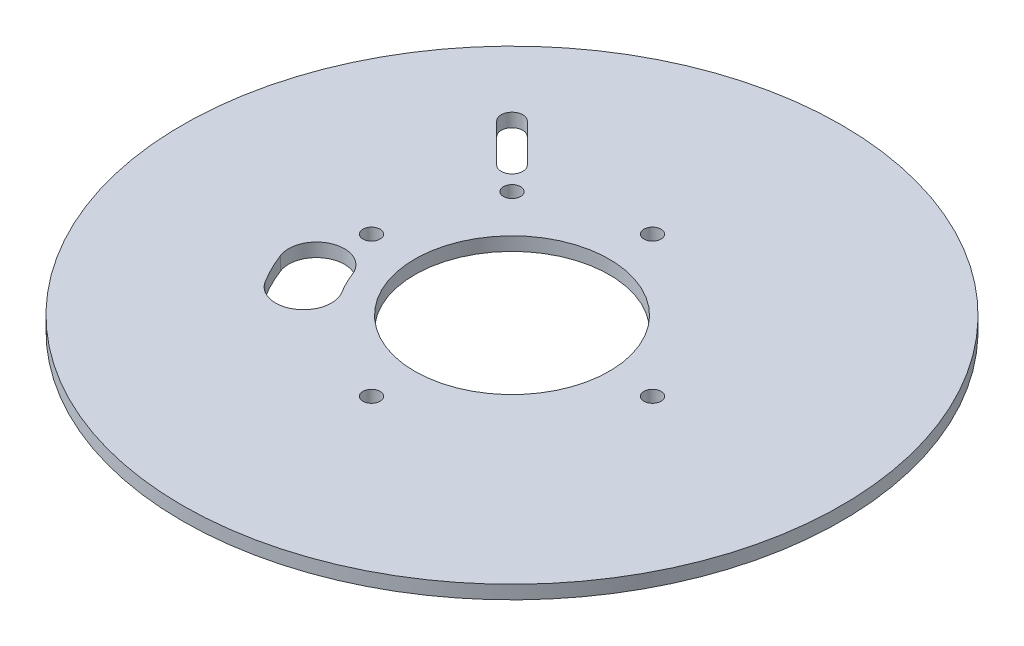
ISO-10303-21;
HEADER;
FILE_DESCRIPTION(('STEP AP214'),'2;1');
FILE_NAME('part.step','',(''),(''),'','','');
FILE_SCHEMA(('AUTOMOTIVE_DESIGN { 1 0 10303 214 1 1 1 1 }'));
ENDSEC;
DATA;
#1=APPLICATION_CONTEXT('core data for automotive mechanical design processes');
#2=APPLICATION_PROTOCOL_DEFINITION('international standard','automotive_design',2000,#1);
#3=PRODUCT_CONTEXT('',#1,'mechanical');
#4=PRODUCT('Part','Part','',(#3));
#5=PRODUCT_RELATED_PRODUCT_CATEGORY('part','',(#4));
#6=PRODUCT_DEFINITION_FORMATION('','',#4);
#7=PRODUCT_DEFINITION_CONTEXT('part definition',#1,'design');
#8=PRODUCT_DEFINITION('design','',#6,#7);
#9=PRODUCT_DEFINITION_SHAPE('','',#8);
#10=(LENGTH_UNIT() NAMED_UNIT(*) SI_UNIT(.MILLI.,.METRE.));
#11=(NAMED_UNIT(*) PLANE_ANGLE_UNIT() SI_UNIT($,.RADIAN.));
#12=(NAMED_UNIT(*) SI_UNIT($,.STERADIAN.) SOLID_ANGLE_UNIT());
#13=UNCERTAINTY_MEASURE_WITH_UNIT(LENGTH_MEASURE(1.E-05),#10,'distance_accuracy_value','');
#14=(GEOMETRIC_REPRESENTATION_CONTEXT(3) GLOBAL_UNCERTAINTY_ASSIGNED_CONTEXT((#13)) GLOBAL_UNIT_ASSIGNED_CONTEXT((#10,
#11,#12)) REPRESENTATION_CONTEXT('',''));
#15=CARTESIAN_POINT('',(0.,0.,0.));
#16=DIRECTION('',(0.,0.,1.));
#17=DIRECTION('',(1.,0.,0.));
#18=AXIS2_PLACEMENT_3D('',#15,#16,#17);
#19=CARTESIAN_POINT('',(0.,3.175,0.));
#20=DIRECTION('',(0.,-1.,0.));
#21=DIRECTION('',(0.,0.,-1.));
#22=AXIS2_PLACEMENT_3D('',#19,#20,#21);
#23=CYLINDRICAL_SURFACE('',#22,77.4600051);
#24=CARTESIAN_POINT('',(0.,3.175,0.));
#25=DIRECTION('',(0.,1.,0.));
#26=DIRECTION('',(0.,0.,1.));
#27=AXIS2_PLACEMENT_3D('',#24,#25,#26);
#28=CIRCLE('',#27,77.4600051);
#29=CARTESIAN_POINT('',(0.,3.175,77.4600051));
#30=VERTEX_POINT('',#29);
#31=EDGE_CURVE('E11',#30,#30,#28,.T.);
#32=ORIENTED_EDGE('',*,*,#31,.F.);
#33=EDGE_LOOP('',(#32));
#34=FACE_BOUND('',#33,.T.);
#35=CARTESIAN_POINT('',(0.,0.,0.));
#36=DIRECTION('',(0.,1.,0.));
#37=DIRECTION('',(0.,0.,1.));
#38=AXIS2_PLACEMENT_3D('',#35,#36,#37);
#39=CIRCLE('',#38,77.4600051);
#40=CARTESIAN_POINT('',(0.,0.,77.4600051));
#41=VERTEX_POINT('',#40);
#42=EDGE_CURVE('E36',#41,#41,#39,.T.);
#43=ORIENTED_EDGE('',*,*,#42,.T.);
#44=EDGE_LOOP('',(#43));
#45=FACE_BOUND('',#44,.T.);
#46=ADVANCED_FACE('F33',(#34,#45),#23,.T.);
#47=CARTESIAN_POINT('',(0.,3.175,0.));
#48=DIRECTION('',(0.,1.,0.));
#49=DIRECTION('',(0.,0.,1.));
#50=AXIS2_PLACEMENT_3D('',#47,#48,#49);
#51=PLANE('',#50);
#52=CARTESIAN_POINT('',(-33.242514605961,3.175,12.7030765646133));
#53=DIRECTION('',(0.,1.,0.));
#54=DIRECTION('',(0.,0.,1.));
#55=AXIS2_PLACEMENT_3D('',#52,#53,#54);
#56=CIRCLE('',#55,6.55197639919967);
#57=CARTESIAN_POINT('',(-27.1221810022313,3.175,10.3642924115272));
#58=VERTEX_POINT('',#57);
#59=CARTESIAN_POINT('',(-39.3628482096907,3.175,15.0418607176993));
#60=VERTEX_POINT('',#59);
#61=EDGE_CURVE('E47',#58,#60,#56,.T.);
#62=ORIENTED_EDGE('',*,*,#61,.F.);
#63=CARTESIAN_POINT('',(0.,3.175,0.));
#64=DIRECTION('',(0.,-1.,0.));
#65=DIRECTION('',(0.,0.,1.));
#66=AXIS2_PLACEMENT_3D('',#63,#64,#65);
#67=CIRCLE('',#66,29.0350005942731);
#68=CARTESIAN_POINT('',(-24.6777747972826,3.175,15.2983231291551));
#69=VERTEX_POINT('',#68);
#70=EDGE_CURVE('E115',#69,#58,#67,.T.);
#71=ORIENTED_EDGE('',*,*,#70,.F.);
#72=CARTESIAN_POINT('',(-30.2465089025766,3.175,18.7505101461351));
#73=DIRECTION('',(0.,1.,0.));
#74=DIRECTION('',(0.,0.,1.));
#75=AXIS2_PLACEMENT_3D('',#72,#73,#74);
#76=CIRCLE('',#75,6.55197639919968);
#77=CARTESIAN_POINT('',(-35.8152430078706,3.175,22.202697163115));
#78=VERTEX_POINT('',#77);
#79=EDGE_CURVE('E118',#78,#69,#76,.T.);
#80=ORIENTED_EDGE('',*,*,#79,.F.);
#81=CARTESIAN_POINT('',(0.,3.175,0.));
#82=DIRECTION('',(0.,1.,0.));
#83=DIRECTION('',(0.,0.,1.));
#84=AXIS2_PLACEMENT_3D('',#81,#82,#83);
#85=CIRCLE('',#84,42.1389533926724);
#86=EDGE_CURVE('E124',#60,#78,#85,.T.);
#87=ORIENTED_EDGE('',*,*,#86,.F.);
#88=EDGE_LOOP('',(#62,#71,#80,#87));
#89=FACE_BOUND('',#88,.T.);
#90=CARTESIAN_POINT('',(-25.1637927540144,3.175,-25.1637927540141));
#91=DIRECTION('',(0.,1.,0.));
#92=DIRECTION('',(0.,0.,1.));
#93=AXIS2_PLACEMENT_3D('',#90,#91,#92);
#94=CIRCLE('',#93,2.0193);
#95=CARTESIAN_POINT('',(-25.1637927540144,3.175,-23.1444927540141));
#96=VERTEX_POINT('',#95);
#97=EDGE_CURVE('E130',#96,#96,#94,.T.);
#98=ORIENTED_EDGE('',*,*,#97,.F.);
#99=EDGE_LOOP('',(#98));
#100=FACE_BOUND('',#99,.T.);
#101=CARTESIAN_POINT('',(-30.5519464266559,3.175,-30.5519464266555));
#102=DIRECTION('',(0.,1.,0.));
#103=DIRECTION('',(0.,0.,1.));
#104=AXIS2_PLACEMENT_3D('',#101,#102,#103);
#105=CIRCLE('',#104,2.54);
#106=CARTESIAN_POINT('',(-32.3479976508697,3.175,-28.7558952024417));
#107=VERTEX_POINT('',#106);
#108=CARTESIAN_POINT('',(-28.755895202442,3.175,-32.3479976508694));
#109=VERTEX_POINT('',#108);
#110=EDGE_CURVE('E137',#107,#109,#105,.T.);
#111=ORIENTED_EDGE('',*,*,#110,.F.);
#112=DIRECTION('',(0.707106781186548,0.,0.707106781186547));
#113=VECTOR('',#112,1.);
#114=CARTESIAN_POINT('',(-32.3479976508697,3.175,-28.7558952024417));
#115=LINE('',#114,#113);
#116=CARTESIAN_POINT('',(-41.3282537719389,3.175,-37.7361513235109));
#117=VERTEX_POINT('',#116);
#118=EDGE_CURVE('E144',#117,#107,#115,.T.);
#119=ORIENTED_EDGE('',*,*,#118,.F.);
#120=CARTESIAN_POINT('',(-39.532202547725,3.175,-39.5322025477247));
#121=DIRECTION('',(0.,1.,0.));
#122=DIRECTION('',(0.,0.,1.));
#123=AXIS2_PLACEMENT_3D('',#120,#121,#122);
#124=CIRCLE('',#123,2.54000000000001);
#125=CARTESIAN_POINT('',(-37.7361513235112,3.175,-41.3282537719385));
#126=VERTEX_POINT('',#125);
#127=EDGE_CURVE('E158',#126,#117,#124,.T.);
#128=ORIENTED_EDGE('',*,*,#127,.F.);
#129=DIRECTION('',(-0.707106781186548,0.,-0.707106781186547));
#130=VECTOR('',#129,1.);
#131=CARTESIAN_POINT('',(-28.755895202442,3.175,-32.3479976508694));
#132=LINE('',#131,#130);
#133=EDGE_CURVE('E155',#109,#126,#132,.T.);
#134=ORIENTED_EDGE('',*,*,#133,.F.);
#135=EDGE_LOOP('',(#111,#119,#128,#134));
#136=FACE_BOUND('',#135,.T.);
#137=CARTESIAN_POINT('',(-33.0199999999991,3.175,5.68989300120393E-13));
#138=DIRECTION('',(0.,1.,0.));
#139=DIRECTION('',(0.,0.,1.));
#140=AXIS2_PLACEMENT_3D('',#137,#138,#139);
#141=CIRCLE('',#140,2.0193);
#142=CARTESIAN_POINT('',(-33.0199999999991,3.175,2.01930000000057));
#143=VERTEX_POINT('',#142);
#144=EDGE_CURVE('E165',#143,#143,#141,.T.);
#145=ORIENTED_EDGE('',*,*,#144,.F.);
#146=EDGE_LOOP('',(#145));
#147=FACE_BOUND('',#146,.T.);
#148=CARTESIAN_POINT('',(1.63757896132211E-12,3.175,33.02));
#149=DIRECTION('',(0.,1.,0.));
#150=DIRECTION('',(0.,0.,1.));
#151=AXIS2_PLACEMENT_3D('',#148,#149,#150);
#152=CIRCLE('',#151,2.0193);
#153=CARTESIAN_POINT('',(1.63757896132211E-12,3.175,35.0393));
#154=VERTEX_POINT('',#153);
#155=EDGE_CURVE('E175',#154,#154,#152,.T.);
#156=ORIENTED_EDGE('',*,*,#155,.F.);
#157=EDGE_LOOP('',(#156));
#158=FACE_BOUND('',#157,.T.);
#159=CARTESIAN_POINT('',(33.0200000000009,3.175,-8.32667268468867E-13));
#160=DIRECTION('',(0.,1.,0.));
#161=DIRECTION('',(0.,0.,1.));
#162=AXIS2_PLACEMENT_3D('',#159,#160,#161);
#163=CIRCLE('',#162,2.01930000000001);
#164=CARTESIAN_POINT('',(33.0200000000009,3.175,2.01929999999917));
#165=VERTEX_POINT('',#164);
#166=EDGE_CURVE('E181',#165,#165,#163,.T.);
#167=ORIENTED_EDGE('',*,*,#166,.F.);
#168=EDGE_LOOP('',(#167));
#169=FACE_BOUND('',#168,.T.);
#170=CARTESIAN_POINT('',(0.,3.175,-33.02));
#171=DIRECTION('',(0.,1.,0.));
#172=DIRECTION('',(0.,0.,1.));
#173=AXIS2_PLACEMENT_3D('',#170,#171,#172);
#174=CIRCLE('',#173,2.01930000000001);
#175=CARTESIAN_POINT('',(0.,3.175,-31.0007));
#176=VERTEX_POINT('',#175);
#177=EDGE_CURVE('E187',#176,#176,#174,.T.);
#178=ORIENTED_EDGE('',*,*,#177,.F.);
#179=EDGE_LOOP('',(#178));
#180=FACE_BOUND('',#179,.T.);
#181=CARTESIAN_POINT('',(0.,3.175,0.));
#182=DIRECTION('',(0.,1.,0.));
#183=DIRECTION('',(0.,0.,1.));
#184=AXIS2_PLACEMENT_3D('',#181,#182,#183);
#185=CIRCLE('',#184,22.86);
#186=CARTESIAN_POINT('',(0.,3.175,22.86));
#187=VERTEX_POINT('',#186);
#188=EDGE_CURVE('E193',#187,#187,#185,.T.);
#189=ORIENTED_EDGE('',*,*,#188,.F.);
#190=EDGE_LOOP('',(#189));
#191=FACE_BOUND('',#190,.T.);
#192=ORIENTED_EDGE('',*,*,#31,.T.);
#193=EDGE_LOOP('',(#192));
#194=FACE_BOUND('',#193,.T.);
#195=ADVANCED_FACE('F204',(#89,#100,#136,#147,#158,#169,#180,#191,#194),#51,.T.);
#196=CARTESIAN_POINT('',(0.,0.,0.));
#197=DIRECTION('',(0.,1.,0.));
#198=DIRECTION('',(0.,0.,1.));
#199=AXIS2_PLACEMENT_3D('',#196,#197,#198);
#200=PLANE('',#199);
#201=CARTESIAN_POINT('',(0.,0.,0.));
#202=DIRECTION('',(0.,-1.,0.));
#203=DIRECTION('',(0.,0.,1.));
#204=AXIS2_PLACEMENT_3D('',#201,#202,#203);
#205=CIRCLE('',#204,29.0350005942731);
#206=CARTESIAN_POINT('',(-24.6777747972826,0.,15.2983231291551));
#207=VERTEX_POINT('',#206);
#208=CARTESIAN_POINT('',(-27.1221810022313,0.,10.3642924115272));
#209=VERTEX_POINT('',#208);
#210=EDGE_CURVE('E105',#207,#209,#205,.T.);
#211=ORIENTED_EDGE('',*,*,#210,.T.);
#212=CARTESIAN_POINT('',(-33.242514605961,0.,12.7030765646133));
#213=DIRECTION('',(0.,1.,0.));
#214=DIRECTION('',(0.,0.,1.));
#215=AXIS2_PLACEMENT_3D('',#212,#213,#214);
#216=CIRCLE('',#215,6.55197639919967);
#217=CARTESIAN_POINT('',(-39.3628482096907,0.,15.0418607176993));
#218=VERTEX_POINT('',#217);
#219=EDGE_CURVE('E99',#209,#218,#216,.T.);
#220=ORIENTED_EDGE('',*,*,#219,.T.);
#221=CARTESIAN_POINT('',(0.,0.,0.));
#222=DIRECTION('',(0.,1.,0.));
#223=DIRECTION('',(0.,0.,1.));
#224=AXIS2_PLACEMENT_3D('',#221,#222,#223);
#225=CIRCLE('',#224,42.1389533926724);
#226=CARTESIAN_POINT('',(-35.8152430078706,0.,22.202697163115));
#227=VERTEX_POINT('',#226);
#228=EDGE_CURVE('E108',#218,#227,#225,.T.);
#229=ORIENTED_EDGE('',*,*,#228,.T.);
#230=CARTESIAN_POINT('',(-30.2465089025766,0.,18.7505101461351));
#231=DIRECTION('',(0.,1.,0.));
#232=DIRECTION('',(0.,0.,1.));
#233=AXIS2_PLACEMENT_3D('',#230,#231,#232);
#234=CIRCLE('',#233,6.55197639919968);
#235=EDGE_CURVE('E55',#227,#207,#234,.T.);
#236=ORIENTED_EDGE('',*,*,#235,.T.);
#237=EDGE_LOOP('',(#211,#220,#229,#236));
#238=FACE_BOUND('',#237,.T.);
#239=CARTESIAN_POINT('',(-25.1637927540144,0.,-25.1637927540141));
#240=DIRECTION('',(0.,1.,0.));
#241=DIRECTION('',(0.,0.,1.));
#242=AXIS2_PLACEMENT_3D('',#239,#240,#241);
#243=CIRCLE('',#242,2.0193);
#244=CARTESIAN_POINT('',(-25.1637927540144,0.,-23.1444927540141));
#245=VERTEX_POINT('',#244);
#246=EDGE_CURVE('E134',#245,#245,#243,.T.);
#247=ORIENTED_EDGE('',*,*,#246,.T.);
#248=EDGE_LOOP('',(#247));
#249=FACE_BOUND('',#248,.T.);
#250=DIRECTION('',(0.707106781186548,0.,0.707106781186547));
#251=VECTOR('',#250,1.);
#252=CARTESIAN_POINT('',(-32.3479976508697,0.,-28.7558952024417));
#253=LINE('',#252,#251);
#254=CARTESIAN_POINT('',(-41.3282537719389,0.,-37.7361513235109));
#255=VERTEX_POINT('',#254);
#256=CARTESIAN_POINT('',(-32.3479976508697,0.,-28.7558952024417));
#257=VERTEX_POINT('',#256);
#258=EDGE_CURVE('E150',#255,#257,#253,.T.);
#259=ORIENTED_EDGE('',*,*,#258,.T.);
#260=CARTESIAN_POINT('',(-30.5519464266559,0.,-30.5519464266555));
#261=DIRECTION('',(0.,1.,0.));
#262=DIRECTION('',(0.,0.,1.));
#263=AXIS2_PLACEMENT_3D('',#260,#261,#262);
#264=CIRCLE('',#263,2.54);
#265=CARTESIAN_POINT('',(-28.755895202442,0.,-32.3479976508694));
#266=VERTEX_POINT('',#265);
#267=EDGE_CURVE('E140',#257,#266,#264,.T.);
#268=ORIENTED_EDGE('',*,*,#267,.T.);
#269=DIRECTION('',(-0.707106781186548,0.,-0.707106781186547));
#270=VECTOR('',#269,1.);
#271=CARTESIAN_POINT('',(-28.755895202442,0.,-32.3479976508694));
#272=LINE('',#271,#270);
#273=CARTESIAN_POINT('',(-37.7361513235112,0.,-41.3282537719385));
#274=VERTEX_POINT('',#273);
#275=EDGE_CURVE('E143',#266,#274,#272,.T.);
#276=ORIENTED_EDGE('',*,*,#275,.T.);
#277=CARTESIAN_POINT('',(-39.532202547725,0.,-39.5322025477247));
#278=DIRECTION('',(0.,1.,0.));
#279=DIRECTION('',(0.,0.,1.));
#280=AXIS2_PLACEMENT_3D('',#277,#278,#279);
#281=CIRCLE('',#280,2.54000000000001);
#282=EDGE_CURVE('E147',#274,#255,#281,.T.);
#283=ORIENTED_EDGE('',*,*,#282,.T.);
#284=EDGE_LOOP('',(#259,#268,#276,#283));
#285=FACE_BOUND('',#284,.T.);
#286=CARTESIAN_POINT('',(-33.0199999999991,0.,5.68989300120393E-13));
#287=DIRECTION('',(0.,1.,0.));
#288=DIRECTION('',(0.,0.,1.));
#289=AXIS2_PLACEMENT_3D('',#286,#287,#288);
#290=CIRCLE('',#289,2.0193);
#291=CARTESIAN_POINT('',(-33.0199999999991,0.,2.01930000000057));
#292=VERTEX_POINT('',#291);
#293=EDGE_CURVE('E172',#292,#292,#290,.T.);
#294=ORIENTED_EDGE('',*,*,#293,.T.);
#295=EDGE_LOOP('',(#294));
#296=FACE_BOUND('',#295,.T.);
#297=CARTESIAN_POINT('',(1.63757896132211E-12,0.,33.02));
#298=DIRECTION('',(0.,1.,0.));
#299=DIRECTION('',(0.,0.,1.));
#300=AXIS2_PLACEMENT_3D('',#297,#298,#299);
#301=CIRCLE('',#300,2.0193);
#302=CARTESIAN_POINT('',(1.63757896132211E-12,0.,35.0393));
#303=VERTEX_POINT('',#302);
#304=EDGE_CURVE('E178',#303,#303,#301,.T.);
#305=ORIENTED_EDGE('',*,*,#304,.T.);
#306=EDGE_LOOP('',(#305));
#307=FACE_BOUND('',#306,.T.);
#308=CARTESIAN_POINT('',(33.0200000000009,0.,-8.32667268468867E-13));
#309=DIRECTION('',(0.,1.,0.));
#310=DIRECTION('',(0.,0.,1.));
#311=AXIS2_PLACEMENT_3D('',#308,#309,#310);
#312=CIRCLE('',#311,2.01930000000001);
#313=CARTESIAN_POINT('',(33.0200000000009,0.,2.01929999999917));
#314=VERTEX_POINT('',#313);
#315=EDGE_CURVE('E184',#314,#314,#312,.T.);
#316=ORIENTED_EDGE('',*,*,#315,.T.);
#317=EDGE_LOOP('',(#316));
#318=FACE_BOUND('',#317,.T.);
#319=CARTESIAN_POINT('',(0.,0.,-33.02));
#320=DIRECTION('',(0.,1.,0.));
#321=DIRECTION('',(0.,0.,1.));
#322=AXIS2_PLACEMENT_3D('',#319,#320,#321);
#323=CIRCLE('',#322,2.01930000000001);
#324=CARTESIAN_POINT('',(0.,0.,-31.0007));
#325=VERTEX_POINT('',#324);
#326=EDGE_CURVE('E190',#325,#325,#323,.T.);
#327=ORIENTED_EDGE('',*,*,#326,.T.);
#328=EDGE_LOOP('',(#327));
#329=FACE_BOUND('',#328,.T.);
#330=CARTESIAN_POINT('',(0.,0.,0.));
#331=DIRECTION('',(0.,1.,0.));
#332=DIRECTION('',(0.,0.,1.));
#333=AXIS2_PLACEMENT_3D('',#330,#331,#332);
#334=CIRCLE('',#333,22.86);
#335=CARTESIAN_POINT('',(0.,0.,22.86));
#336=VERTEX_POINT('',#335);
#337=EDGE_CURVE('E196',#336,#336,#334,.T.);
#338=ORIENTED_EDGE('',*,*,#337,.T.);
#339=EDGE_LOOP('',(#338));
#340=FACE_BOUND('',#339,.T.);
#341=ORIENTED_EDGE('',*,*,#42,.F.);
#342=EDGE_LOOP('',(#341));
#343=FACE_BOUND('',#342,.T.);
#344=ADVANCED_FACE('F112',(#238,#249,#285,#296,#307,#318,#329,#340,#343),#200,.F.);
#345=CARTESIAN_POINT('',(0.,0.,0.));
#346=DIRECTION('',(0.,1.,0.));
#347=DIRECTION('',(0.,0.,1.));
#348=AXIS2_PLACEMENT_3D('',#345,#346,#347);
#349=CYLINDRICAL_SURFACE('',#348,22.86);
#350=ORIENTED_EDGE('',*,*,#337,.F.);
#351=EDGE_LOOP('',(#350));
#352=FACE_BOUND('',#351,.T.);
#353=ORIENTED_EDGE('',*,*,#188,.T.);
#354=EDGE_LOOP('',(#353));
#355=FACE_BOUND('',#354,.T.);
#356=ADVANCED_FACE('F202',(#352,#355),#349,.F.);
#357=CARTESIAN_POINT('',(0.,0.,-33.02));
#358=DIRECTION('',(0.,1.,0.));
#359=DIRECTION('',(0.,0.,1.));
#360=AXIS2_PLACEMENT_3D('',#357,#358,#359);
#361=CYLINDRICAL_SURFACE('',#360,2.01930000000001);
#362=ORIENTED_EDGE('',*,*,#326,.F.);
#363=EDGE_LOOP('',(#362));
#364=FACE_BOUND('',#363,.T.);
#365=ORIENTED_EDGE('',*,*,#177,.T.);
#366=EDGE_LOOP('',(#365));
#367=FACE_BOUND('',#366,.T.);
#368=ADVANCED_FACE('F221',(#364,#367),#361,.F.);
#369=CARTESIAN_POINT('',(33.0200000000009,0.,-8.32667268468867E-13));
#370=DIRECTION('',(0.,1.,0.));
#371=DIRECTION('',(0.,0.,1.));
#372=AXIS2_PLACEMENT_3D('',#369,#370,#371);
#373=CYLINDRICAL_SURFACE('',#372,2.01930000000001);
#374=ORIENTED_EDGE('',*,*,#315,.F.);
#375=EDGE_LOOP('',(#374));
#376=FACE_BOUND('',#375,.T.);
#377=ORIENTED_EDGE('',*,*,#166,.T.);
#378=EDGE_LOOP('',(#377));
#379=FACE_BOUND('',#378,.T.);
#380=ADVANCED_FACE('F227',(#376,#379),#373,.F.);
#381=CARTESIAN_POINT('',(1.63757896132211E-12,0.,33.02));
#382=DIRECTION('',(0.,1.,0.));
#383=DIRECTION('',(0.,0.,1.));
#384=AXIS2_PLACEMENT_3D('',#381,#382,#383);
#385=CYLINDRICAL_SURFACE('',#384,2.0193);
#386=ORIENTED_EDGE('',*,*,#304,.F.);
#387=EDGE_LOOP('',(#386));
#388=FACE_BOUND('',#387,.T.);
#389=ORIENTED_EDGE('',*,*,#155,.T.);
#390=EDGE_LOOP('',(#389));
#391=FACE_BOUND('',#390,.T.);
#392=ADVANCED_FACE('F231',(#388,#391),#385,.F.);
#393=CARTESIAN_POINT('',(-33.0199999999991,0.,5.68989300120393E-13));
#394=DIRECTION('',(0.,1.,0.));
#395=DIRECTION('',(0.,0.,1.));
#396=AXIS2_PLACEMENT_3D('',#393,#394,#395);
#397=CYLINDRICAL_SURFACE('',#396,2.0193);
#398=ORIENTED_EDGE('',*,*,#293,.F.);
#399=EDGE_LOOP('',(#398));
#400=FACE_BOUND('',#399,.T.);
#401=ORIENTED_EDGE('',*,*,#144,.T.);
#402=EDGE_LOOP('',(#401));
#403=FACE_BOUND('',#402,.T.);
#404=ADVANCED_FACE('F235',(#400,#403),#397,.F.);
#405=CARTESIAN_POINT('',(-30.5519464266559,0.,-30.5519464266555));
#406=DIRECTION('',(0.,1.,0.));
#407=DIRECTION('',(0.,0.,1.));
#408=AXIS2_PLACEMENT_3D('',#405,#406,#407);
#409=CYLINDRICAL_SURFACE('',#408,2.54);
#410=ORIENTED_EDGE('',*,*,#110,.T.);
#411=DIRECTION('',(0.,1.,0.));
#412=VECTOR('',#411,1.);
#413=CARTESIAN_POINT('',(-28.755895202442,0.,-32.3479976508694));
#414=LINE('',#413,#412);
#415=EDGE_CURVE('E153',#266,#109,#414,.T.);
#416=ORIENTED_EDGE('',*,*,#415,.F.);
#417=ORIENTED_EDGE('',*,*,#267,.F.);
#418=DIRECTION('',(0.,1.,0.));
#419=VECTOR('',#418,1.);
#420=CARTESIAN_POINT('',(-32.3479976508697,0.,-28.7558952024417));
#421=LINE('',#420,#419);
#422=EDGE_CURVE('E163',#257,#107,#421,.T.);
#423=ORIENTED_EDGE('',*,*,#422,.T.);
#424=EDGE_LOOP('',(#410,#416,#417,#423));
#425=FACE_BOUND('',#424,.T.);
#426=ADVANCED_FACE('F239',(#425),#409,.F.);
#427=CARTESIAN_POINT('',(-32.3479976508697,0.,-28.7558952024417));
#428=DIRECTION('',(-0.707106781186547,0.,0.707106781186548));
#429=DIRECTION('',(0.707106781186548,0.,0.707106781186547));
#430=AXIS2_PLACEMENT_3D('',#427,#428,#429);
#431=PLANE('',#430);
#432=ORIENTED_EDGE('',*,*,#118,.T.);
#433=ORIENTED_EDGE('',*,*,#422,.F.);
#434=ORIENTED_EDGE('',*,*,#258,.F.);
#435=DIRECTION('',(0.,1.,0.));
#436=VECTOR('',#435,1.);
#437=CARTESIAN_POINT('',(-41.3282537719389,0.,-37.7361513235109));
#438=LINE('',#437,#436);
#439=EDGE_CURVE('E166',#255,#117,#438,.T.);
#440=ORIENTED_EDGE('',*,*,#439,.T.);
#441=EDGE_LOOP('',(#432,#433,#434,#440));
#442=FACE_BOUND('',#441,.T.);
#443=ADVANCED_FACE('F243',(#442),#431,.F.);
#444=CARTESIAN_POINT('',(-39.532202547725,0.,-39.5322025477247));
#445=DIRECTION('',(0.,1.,0.));
#446=DIRECTION('',(0.,0.,1.));
#447=AXIS2_PLACEMENT_3D('',#444,#445,#446);
#448=CYLINDRICAL_SURFACE('',#447,2.54000000000001);
#449=ORIENTED_EDGE('',*,*,#127,.T.);
#450=ORIENTED_EDGE('',*,*,#439,.F.);
#451=ORIENTED_EDGE('',*,*,#282,.F.);
#452=DIRECTION('',(0.,1.,0.));
#453=VECTOR('',#452,1.);
#454=CARTESIAN_POINT('',(-37.7361513235112,0.,-41.3282537719385));
#455=LINE('',#454,#453);
#456=EDGE_CURVE('E168',#274,#126,#455,.T.);
#457=ORIENTED_EDGE('',*,*,#456,.T.);
#458=EDGE_LOOP('',(#449,#450,#451,#457));
#459=FACE_BOUND('',#458,.T.);
#460=ADVANCED_FACE('F249',(#459),#448,.F.);
#461=CARTESIAN_POINT('',(-28.755895202442,0.,-32.3479976508694));
#462=DIRECTION('',(0.707106781186547,0.,-0.707106781186548));
#463=DIRECTION('',(-0.707106781186548,0.,-0.707106781186547));
#464=AXIS2_PLACEMENT_3D('',#461,#462,#463);
#465=PLANE('',#464);
#466=ORIENTED_EDGE('',*,*,#133,.T.);
#467=ORIENTED_EDGE('',*,*,#456,.F.);
#468=ORIENTED_EDGE('',*,*,#275,.F.);
#469=ORIENTED_EDGE('',*,*,#415,.T.);
#470=EDGE_LOOP('',(#466,#467,#468,#469));
#471=FACE_BOUND('',#470,.T.);
#472=ADVANCED_FACE('F245',(#471),#465,.F.);
#473=CARTESIAN_POINT('',(-25.1637927540144,0.,-25.1637927540141));
#474=DIRECTION('',(0.,1.,0.));
#475=DIRECTION('',(0.,0.,1.));
#476=AXIS2_PLACEMENT_3D('',#473,#474,#475);
#477=CYLINDRICAL_SURFACE('',#476,2.0193);
#478=ORIENTED_EDGE('',*,*,#246,.F.);
#479=EDGE_LOOP('',(#478));
#480=FACE_BOUND('',#479,.T.);
#481=ORIENTED_EDGE('',*,*,#97,.T.);
#482=EDGE_LOOP('',(#481));
#483=FACE_BOUND('',#482,.T.);
#484=ADVANCED_FACE('F248',(#480,#483),#477,.F.);
#485=CARTESIAN_POINT('',(-33.242514605961,0.,12.7030765646133));
#486=DIRECTION('',(0.,1.,0.));
#487=DIRECTION('',(0.,0.,1.));
#488=AXIS2_PLACEMENT_3D('',#485,#486,#487);
#489=CYLINDRICAL_SURFACE('',#488,6.55197639919967);
#490=ORIENTED_EDGE('',*,*,#61,.T.);
#491=DIRECTION('',(0.,1.,0.));
#492=VECTOR('',#491,1.);
#493=CARTESIAN_POINT('',(-39.3628482096907,0.,15.0418607176993));
#494=LINE('',#493,#492);
#495=EDGE_CURVE('E95',#218,#60,#494,.T.);
#496=ORIENTED_EDGE('',*,*,#495,.F.);
#497=ORIENTED_EDGE('',*,*,#219,.F.);
#498=DIRECTION('',(0.,1.,0.));
#499=VECTOR('',#498,1.);
#500=CARTESIAN_POINT('',(-27.1221810022313,0.,10.3642924115272));
#501=LINE('',#500,#499);
#502=EDGE_CURVE('E128',#209,#58,#501,.T.);
#503=ORIENTED_EDGE('',*,*,#502,.T.);
#504=EDGE_LOOP('',(#490,#496,#497,#503));
#505=FACE_BOUND('',#504,.T.);
#506=ADVANCED_FACE('F97',(#505),#489,.F.);
#507=CARTESIAN_POINT('',(0.,0.,0.));
#508=DIRECTION('',(0.,1.,0.));
#509=DIRECTION('',(0.,0.,1.));
#510=AXIS2_PLACEMENT_3D('',#507,#508,#509);
#511=CYLINDRICAL_SURFACE('',#510,29.0350005942731);
#512=ORIENTED_EDGE('',*,*,#70,.T.);
#513=ORIENTED_EDGE('',*,*,#502,.F.);
#514=ORIENTED_EDGE('',*,*,#210,.F.);
#515=DIRECTION('',(0.,1.,0.));
#516=VECTOR('',#515,1.);
#517=CARTESIAN_POINT('',(-24.6777747972826,0.,15.2983231291551));
#518=LINE('',#517,#516);
#519=EDGE_CURVE('E131',#207,#69,#518,.T.);
#520=ORIENTED_EDGE('',*,*,#519,.T.);
#521=EDGE_LOOP('',(#512,#513,#514,#520));
#522=FACE_BOUND('',#521,.T.);
#523=ADVANCED_FACE('F262',(#522),#511,.T.);
#524=CARTESIAN_POINT('',(-30.2465089025766,0.,18.7505101461351));
#525=DIRECTION('',(0.,1.,0.));
#526=DIRECTION('',(0.,0.,1.));
#527=AXIS2_PLACEMENT_3D('',#524,#525,#526);
#528=CYLINDRICAL_SURFACE('',#527,6.55197639919968);
#529=ORIENTED_EDGE('',*,*,#79,.T.);
#530=ORIENTED_EDGE('',*,*,#519,.F.);
#531=ORIENTED_EDGE('',*,*,#235,.F.);
#532=DIRECTION('',(0.,1.,0.));
#533=VECTOR('',#532,1.);
#534=CARTESIAN_POINT('',(-35.8152430078706,0.,22.202697163115));
#535=LINE('',#534,#533);
#536=EDGE_CURVE('E104',#227,#78,#535,.T.);
#537=ORIENTED_EDGE('',*,*,#536,.T.);
#538=EDGE_LOOP('',(#529,#530,#531,#537));
#539=FACE_BOUND('',#538,.T.);
#540=ADVANCED_FACE('F265',(#539),#528,.F.);
#541=CARTESIAN_POINT('',(0.,0.,0.));
#542=DIRECTION('',(0.,1.,0.));
#543=DIRECTION('',(0.,0.,1.));
#544=AXIS2_PLACEMENT_3D('',#541,#542,#543);
#545=CYLINDRICAL_SURFACE('',#544,42.1389533926724);
#546=ORIENTED_EDGE('',*,*,#86,.T.);
#547=ORIENTED_EDGE('',*,*,#536,.F.);
#548=ORIENTED_EDGE('',*,*,#228,.F.);
#549=ORIENTED_EDGE('',*,*,#495,.T.);
#550=EDGE_LOOP('',(#546,#547,#548,#549));
#551=FACE_BOUND('',#550,.T.);
#552=ADVANCED_FACE('F109',(#551),#545,.F.);
#553=CLOSED_SHELL('',(#46,#195,#344,#356,#368,#380,#392,#404,#426,#443,#460,#472,#484,#506,#523,
#540,#552));
#554=MANIFOLD_SOLID_BREP('B2',#553);
#555=ADVANCED_BREP_SHAPE_REPRESENTATION('',(#18,#554),#14);
#556=SHAPE_DEFINITION_REPRESENTATION(#9,#555);
ENDSEC;
END-ISO-10303-21;
